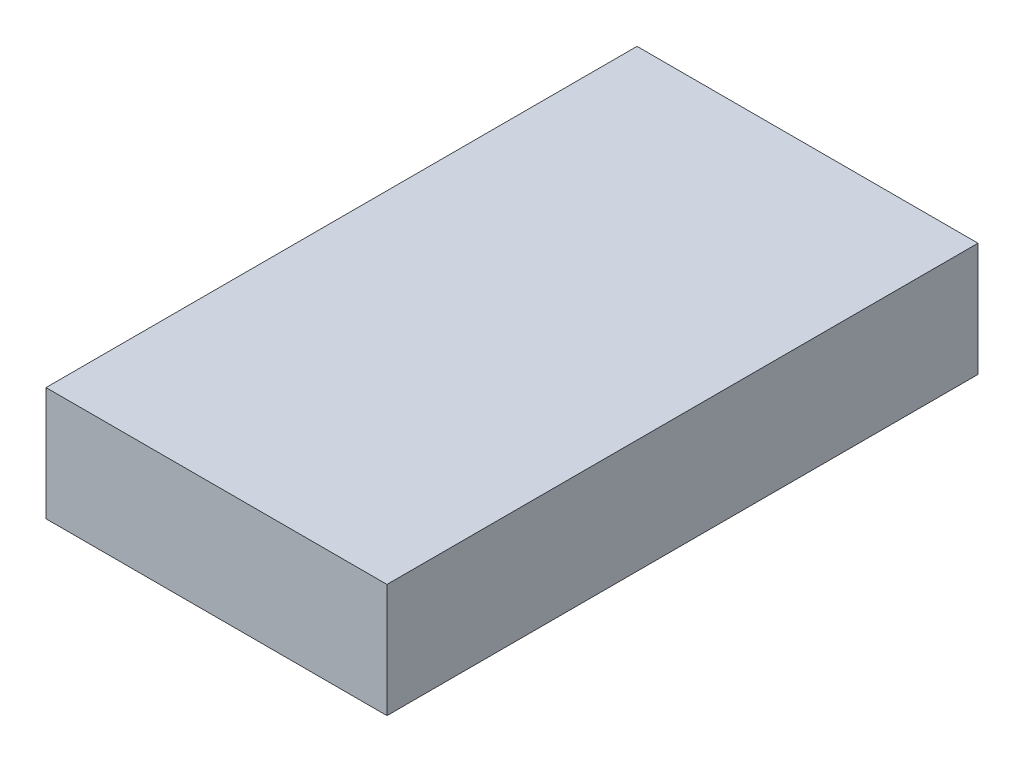
ISO-10303-21;
HEADER;
FILE_DESCRIPTION(('STEP AP214'),'2;1');
FILE_NAME('part.step','',(''),(''),'','','');
FILE_SCHEMA(('AUTOMOTIVE_DESIGN { 1 0 10303 214 1 1 1 1 }'));
ENDSEC;
DATA;
#1=APPLICATION_CONTEXT('core data for automotive mechanical design processes');
#2=APPLICATION_PROTOCOL_DEFINITION('international standard','automotive_design',2000,#1);
#3=PRODUCT_CONTEXT('',#1,'mechanical');
#4=PRODUCT('Part','Part','',(#3));
#5=PRODUCT_RELATED_PRODUCT_CATEGORY('part','',(#4));
#6=PRODUCT_DEFINITION_FORMATION('','',#4);
#7=PRODUCT_DEFINITION_CONTEXT('part definition',#1,'design');
#8=PRODUCT_DEFINITION('design','',#6,#7);
#9=PRODUCT_DEFINITION_SHAPE('','',#8);
#10=(LENGTH_UNIT() NAMED_UNIT(*) SI_UNIT(.MILLI.,.METRE.));
#11=(NAMED_UNIT(*) PLANE_ANGLE_UNIT() SI_UNIT($,.RADIAN.));
#12=(NAMED_UNIT(*) SI_UNIT($,.STERADIAN.) SOLID_ANGLE_UNIT());
#13=UNCERTAINTY_MEASURE_WITH_UNIT(LENGTH_MEASURE(1.E-05),#10,'distance_accuracy_value','');
#14=(GEOMETRIC_REPRESENTATION_CONTEXT(3) GLOBAL_UNCERTAINTY_ASSIGNED_CONTEXT((#13)) GLOBAL_UNIT_ASSIGNED_CONTEXT((#10,
#11,#12)) REPRESENTATION_CONTEXT('',''));
#15=CARTESIAN_POINT('',(0.,0.,0.));
#16=DIRECTION('',(0.,0.,1.));
#17=DIRECTION('',(1.,0.,0.));
#18=AXIS2_PLACEMENT_3D('',#15,#16,#17);
#19=CARTESIAN_POINT('',(-69.5641990945761,100.,-513.909749106506));
#20=DIRECTION('',(1.,0.,0.));
#21=DIRECTION('',(0.,0.,-1.));
#22=AXIS2_PLACEMENT_3D('',#19,#20,#21);
#23=PLANE('',#22);
#24=DIRECTION('',(0.,0.,1.));
#25=VECTOR('',#24,1.);
#26=CARTESIAN_POINT('',(-69.5641990945761,0.,-513.909749106506));
#27=LINE('',#26,#25);
#28=CARTESIAN_POINT('',(-69.5641990945761,0.,-513.909749106506));
#29=VERTEX_POINT('',#28);
#30=CARTESIAN_POINT('',(-69.564199094576,0.,6.09025089349401));
#31=VERTEX_POINT('',#30);
#32=EDGE_CURVE('E98',#29,#31,#27,.T.);
#33=ORIENTED_EDGE('',*,*,#32,.T.);
#34=DIRECTION('',(0.,-1.,0.));
#35=VECTOR('',#34,1.);
#36=CARTESIAN_POINT('',(-69.564199094576,100.,6.09025089349401));
#37=LINE('',#36,#35);
#38=CARTESIAN_POINT('',(-69.564199094576,100.,6.09025089349401));
#39=VERTEX_POINT('',#38);
#40=EDGE_CURVE('E11',#39,#31,#37,.T.);
#41=ORIENTED_EDGE('',*,*,#40,.F.);
#42=DIRECTION('',(0.,0.,1.));
#43=VECTOR('',#42,1.);
#44=CARTESIAN_POINT('',(-69.5641990945761,100.,-513.909749106506));
#45=LINE('',#44,#43);
#46=CARTESIAN_POINT('',(-69.5641990945761,100.,-513.909749106506));
#47=VERTEX_POINT('',#46);
#48=EDGE_CURVE('E86',#47,#39,#45,.T.);
#49=ORIENTED_EDGE('',*,*,#48,.F.);
#50=DIRECTION('',(0.,-1.,0.));
#51=VECTOR('',#50,1.);
#52=CARTESIAN_POINT('',(-69.5641990945761,100.,-513.909749106506));
#53=LINE('',#52,#51);
#54=EDGE_CURVE('E94',#47,#29,#53,.T.);
#55=ORIENTED_EDGE('',*,*,#54,.T.);
#56=EDGE_LOOP('',(#33,#41,#49,#55));
#57=FACE_BOUND('',#56,.T.);
#58=ADVANCED_FACE('F35',(#57),#23,.F.);
#59=CARTESIAN_POINT('',(-69.564199094576,100.,6.09025089349401));
#60=DIRECTION('',(0.,0.,-1.));
#61=DIRECTION('',(-1.,0.,0.));
#62=AXIS2_PLACEMENT_3D('',#59,#60,#61);
#63=PLANE('',#62);
#64=DIRECTION('',(1.,0.,0.));
#65=VECTOR('',#64,1.);
#66=CARTESIAN_POINT('',(-69.564199094576,0.,6.09025089349401));
#67=LINE('',#66,#65);
#68=CARTESIAN_POINT('',(230.435800905424,0.,6.09025089349401));
#69=VERTEX_POINT('',#68);
#70=EDGE_CURVE('E90',#31,#69,#67,.T.);
#71=ORIENTED_EDGE('',*,*,#70,.T.);
#72=DIRECTION('',(0.,-1.,0.));
#73=VECTOR('',#72,1.);
#74=CARTESIAN_POINT('',(230.435800905424,100.,6.09025089349401));
#75=LINE('',#74,#73);
#76=CARTESIAN_POINT('',(230.435800905424,100.,6.09025089349401));
#77=VERTEX_POINT('',#76);
#78=EDGE_CURVE('E43',#77,#69,#75,.T.);
#79=ORIENTED_EDGE('',*,*,#78,.F.);
#80=DIRECTION('',(1.,0.,0.));
#81=VECTOR('',#80,1.);
#82=CARTESIAN_POINT('',(-69.564199094576,100.,6.09025089349401));
#83=LINE('',#82,#81);
#84=EDGE_CURVE('E81',#39,#77,#83,.T.);
#85=ORIENTED_EDGE('',*,*,#84,.F.);
#86=ORIENTED_EDGE('',*,*,#40,.T.);
#87=EDGE_LOOP('',(#71,#79,#85,#86));
#88=FACE_BOUND('',#87,.T.);
#89=ADVANCED_FACE('F89',(#88),#63,.F.);
#90=CARTESIAN_POINT('',(230.435800905424,100.,-513.909749106506));
#91=DIRECTION('',(-1.,0.,0.));
#92=DIRECTION('',(0.,0.,1.));
#93=AXIS2_PLACEMENT_3D('',#90,#91,#92);
#94=PLANE('',#93);
#95=DIRECTION('',(0.,0.,-1.));
#96=VECTOR('',#95,1.);
#97=CARTESIAN_POINT('',(230.435800905424,0.,-513.909749106506));
#98=LINE('',#97,#96);
#99=CARTESIAN_POINT('',(230.435800905424,0.,-513.909749106506));
#100=VERTEX_POINT('',#99);
#101=EDGE_CURVE('E68',#69,#100,#98,.T.);
#102=ORIENTED_EDGE('',*,*,#101,.T.);
#103=DIRECTION('',(0.,-1.,0.));
#104=VECTOR('',#103,1.);
#105=CARTESIAN_POINT('',(230.435800905424,100.,-513.909749106506));
#106=LINE('',#105,#104);
#107=CARTESIAN_POINT('',(230.435800905424,100.,-513.909749106506));
#108=VERTEX_POINT('',#107);
#109=EDGE_CURVE('E91',#108,#100,#106,.T.);
#110=ORIENTED_EDGE('',*,*,#109,.F.);
#111=DIRECTION('',(0.,0.,-1.));
#112=VECTOR('',#111,1.);
#113=CARTESIAN_POINT('',(230.435800905424,100.,-513.909749106506));
#114=LINE('',#113,#112);
#115=EDGE_CURVE('E84',#77,#108,#114,.T.);
#116=ORIENTED_EDGE('',*,*,#115,.F.);
#117=ORIENTED_EDGE('',*,*,#78,.T.);
#118=EDGE_LOOP('',(#102,#110,#116,#117));
#119=FACE_BOUND('',#118,.T.);
#120=ADVANCED_FACE('F92',(#119),#94,.F.);
#121=CARTESIAN_POINT('',(-69.5641990945761,100.,-513.909749106506));
#122=DIRECTION('',(0.,0.,1.));
#123=DIRECTION('',(1.,0.,0.));
#124=AXIS2_PLACEMENT_3D('',#121,#122,#123);
#125=PLANE('',#124);
#126=DIRECTION('',(-1.,0.,0.));
#127=VECTOR('',#126,1.);
#128=CARTESIAN_POINT('',(-69.5641990945761,0.,-513.909749106506));
#129=LINE('',#128,#127);
#130=EDGE_CURVE('E74',#100,#29,#129,.T.);
#131=ORIENTED_EDGE('',*,*,#130,.T.);
#132=ORIENTED_EDGE('',*,*,#54,.F.);
#133=DIRECTION('',(-1.,0.,0.));
#134=VECTOR('',#133,1.);
#135=CARTESIAN_POINT('',(-69.5641990945761,100.,-513.909749106506));
#136=LINE('',#135,#134);
#137=EDGE_CURVE('E51',#108,#47,#136,.T.);
#138=ORIENTED_EDGE('',*,*,#137,.F.);
#139=ORIENTED_EDGE('',*,*,#109,.T.);
#140=EDGE_LOOP('',(#131,#132,#138,#139));
#141=FACE_BOUND('',#140,.T.);
#142=ADVANCED_FACE('F105',(#141),#125,.F.);
#143=CARTESIAN_POINT('',(0.,100.,0.));
#144=DIRECTION('',(0.,1.,0.));
#145=DIRECTION('',(0.,0.,1.));
#146=AXIS2_PLACEMENT_3D('',#143,#144,#145);
#147=PLANE('',#146);
#148=ORIENTED_EDGE('',*,*,#48,.T.);
#149=ORIENTED_EDGE('',*,*,#84,.T.);
#150=ORIENTED_EDGE('',*,*,#115,.T.);
#151=ORIENTED_EDGE('',*,*,#137,.T.);
#152=EDGE_LOOP('',(#148,#149,#150,#151));
#153=FACE_BOUND('',#152,.T.);
#154=ADVANCED_FACE('F82',(#153),#147,.T.);
#155=CARTESIAN_POINT('',(0.,0.,0.));
#156=DIRECTION('',(0.,1.,0.));
#157=DIRECTION('',(0.,0.,1.));
#158=AXIS2_PLACEMENT_3D('',#155,#156,#157);
#159=PLANE('',#158);
#160=ORIENTED_EDGE('',*,*,#32,.F.);
#161=ORIENTED_EDGE('',*,*,#130,.F.);
#162=ORIENTED_EDGE('',*,*,#101,.F.);
#163=ORIENTED_EDGE('',*,*,#70,.F.);
#164=EDGE_LOOP('',(#160,#161,#162,#163));
#165=FACE_BOUND('',#164,.T.);
#166=ADVANCED_FACE('F108',(#165),#159,.F.);
#167=CLOSED_SHELL('',(#58,#89,#120,#142,#154,#166));
#168=MANIFOLD_SOLID_BREP('B2',#167);
#169=ADVANCED_BREP_SHAPE_REPRESENTATION('',(#18,#168),#14);
#170=SHAPE_DEFINITION_REPRESENTATION(#9,#169);
ENDSEC;
END-ISO-10303-21;
